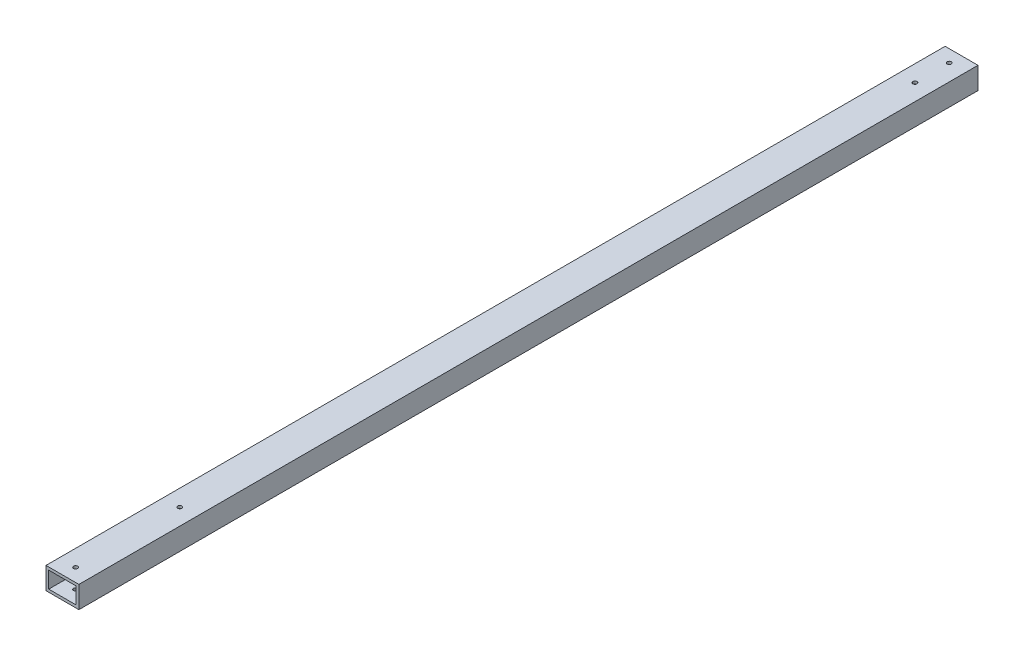
ISO-10303-21;
HEADER;
FILE_DESCRIPTION(('STEP AP214'),'2;1');
FILE_NAME('part.step','',(''),(''),'','','');
FILE_SCHEMA(('AUTOMOTIVE_DESIGN { 1 0 10303 214 1 1 1 1 }'));
ENDSEC;
DATA;
#1=APPLICATION_CONTEXT('core data for automotive mechanical design processes');
#2=APPLICATION_PROTOCOL_DEFINITION('international standard','automotive_design',2000,#1);
#3=PRODUCT_CONTEXT('',#1,'mechanical');
#4=PRODUCT('Part','Part','',(#3));
#5=PRODUCT_RELATED_PRODUCT_CATEGORY('part','',(#4));
#6=PRODUCT_DEFINITION_FORMATION('','',#4);
#7=PRODUCT_DEFINITION_CONTEXT('part definition',#1,'design');
#8=PRODUCT_DEFINITION('design','',#6,#7);
#9=PRODUCT_DEFINITION_SHAPE('','',#8);
#10=(LENGTH_UNIT() NAMED_UNIT(*) SI_UNIT(.MILLI.,.METRE.));
#11=(NAMED_UNIT(*) PLANE_ANGLE_UNIT() SI_UNIT($,.RADIAN.));
#12=(NAMED_UNIT(*) SI_UNIT($,.STERADIAN.) SOLID_ANGLE_UNIT());
#13=UNCERTAINTY_MEASURE_WITH_UNIT(LENGTH_MEASURE(1.E-05),#10,'distance_accuracy_value','');
#14=(GEOMETRIC_REPRESENTATION_CONTEXT(3) GLOBAL_UNCERTAINTY_ASSIGNED_CONTEXT((#13)) GLOBAL_UNIT_ASSIGNED_CONTEXT((#10,
#11,#12)) REPRESENTATION_CONTEXT('',''));
#15=CARTESIAN_POINT('',(0.,0.,0.));
#16=DIRECTION('',(0.,0.,1.));
#17=DIRECTION('',(1.,0.,0.));
#18=AXIS2_PLACEMENT_3D('',#15,#16,#17);
#19=CARTESIAN_POINT('',(19.05,-12.7,-520.7));
#20=DIRECTION('',(1.,0.,0.));
#21=DIRECTION('',(0.,0.,-1.));
#22=AXIS2_PLACEMENT_3D('',#19,#20,#21);
#23=PLANE('',#22);
#24=DIRECTION('',(0.,0.,1.));
#25=VECTOR('',#24,1.);
#26=CARTESIAN_POINT('',(19.05,12.7,-520.7));
#27=LINE('',#26,#25);
#28=CARTESIAN_POINT('',(19.05,12.7,-520.7));
#29=VERTEX_POINT('',#28);
#30=CARTESIAN_POINT('',(19.05,12.7,520.7));
#31=VERTEX_POINT('',#30);
#32=EDGE_CURVE('E161',#29,#31,#27,.T.);
#33=ORIENTED_EDGE('',*,*,#32,.T.);
#34=DIRECTION('',(0.,1.,0.));
#35=VECTOR('',#34,1.);
#36=CARTESIAN_POINT('',(19.05,-12.7,520.7));
#37=LINE('',#36,#35);
#38=CARTESIAN_POINT('',(19.05,-12.7,520.7));
#39=VERTEX_POINT('',#38);
#40=EDGE_CURVE('E129',#39,#31,#37,.T.);
#41=ORIENTED_EDGE('',*,*,#40,.F.);
#42=DIRECTION('',(0.,0.,1.));
#43=VECTOR('',#42,1.);
#44=CARTESIAN_POINT('',(19.05,-12.7,-520.7));
#45=LINE('',#44,#43);
#46=CARTESIAN_POINT('',(19.05,-12.7,-520.7));
#47=VERTEX_POINT('',#46);
#48=EDGE_CURVE('E11',#47,#39,#45,.T.);
#49=ORIENTED_EDGE('',*,*,#48,.F.);
#50=DIRECTION('',(0.,1.,0.));
#51=VECTOR('',#50,1.);
#52=CARTESIAN_POINT('',(19.05,-12.7,-520.7));
#53=LINE('',#52,#51);
#54=EDGE_CURVE('E148',#47,#29,#53,.T.);
#55=ORIENTED_EDGE('',*,*,#54,.T.);
#56=EDGE_LOOP('',(#33,#41,#49,#55));
#57=FACE_BOUND('',#56,.T.);
#58=ADVANCED_FACE('F32',(#57),#23,.T.);
#59=CARTESIAN_POINT('',(-19.05,-12.7,-520.7));
#60=DIRECTION('',(0.,-1.,0.));
#61=DIRECTION('',(0.,0.,-1.));
#62=AXIS2_PLACEMENT_3D('',#59,#60,#61);
#63=PLANE('',#62);
#64=CARTESIAN_POINT('',(0.,-12.7,-506.4125));
#65=DIRECTION('',(0.,-1.,0.));
#66=DIRECTION('',(0.,0.,-1.));
#67=AXIS2_PLACEMENT_3D('',#64,#65,#66);
#68=CIRCLE('',#67,2.38125000000001);
#69=CARTESIAN_POINT('',(0.,-12.7,-508.79375));
#70=VERTEX_POINT('',#69);
#71=EDGE_CURVE('E186',#70,#70,#68,.T.);
#72=ORIENTED_EDGE('',*,*,#71,.F.);
#73=EDGE_LOOP('',(#72));
#74=FACE_BOUND('',#73,.T.);
#75=CARTESIAN_POINT('',(0.,-12.7,-466.725));
#76=DIRECTION('',(0.,-1.,0.));
#77=DIRECTION('',(0.,0.,-1.));
#78=AXIS2_PLACEMENT_3D('',#75,#76,#77);
#79=CIRCLE('',#78,2.38125000000001);
#80=CARTESIAN_POINT('',(0.,-12.7,-469.10625));
#81=VERTEX_POINT('',#80);
#82=EDGE_CURVE('E183',#81,#81,#79,.T.);
#83=ORIENTED_EDGE('',*,*,#82,.F.);
#84=EDGE_LOOP('',(#83));
#85=FACE_BOUND('',#84,.T.);
#86=CARTESIAN_POINT('',(0.,-12.7,384.81));
#87=DIRECTION('',(0.,-1.,0.));
#88=DIRECTION('',(0.,0.,-1.));
#89=AXIS2_PLACEMENT_3D('',#86,#87,#88);
#90=CIRCLE('',#89,2.38125000000001);
#91=CARTESIAN_POINT('',(0.,-12.7,382.42875));
#92=VERTEX_POINT('',#91);
#93=EDGE_CURVE('E201',#92,#92,#90,.T.);
#94=ORIENTED_EDGE('',*,*,#93,.F.);
#95=EDGE_LOOP('',(#94));
#96=FACE_BOUND('',#95,.T.);
#97=CARTESIAN_POINT('',(0.,-12.7,505.46));
#98=DIRECTION('',(0.,-1.,0.));
#99=DIRECTION('',(0.,0.,-1.));
#100=AXIS2_PLACEMENT_3D('',#97,#98,#99);
#101=CIRCLE('',#100,2.38125000000001);
#102=CARTESIAN_POINT('',(0.,-12.7,503.07875));
#103=VERTEX_POINT('',#102);
#104=EDGE_CURVE('E118',#103,#103,#101,.T.);
#105=ORIENTED_EDGE('',*,*,#104,.F.);
#106=EDGE_LOOP('',(#105));
#107=FACE_BOUND('',#106,.T.);
#108=ORIENTED_EDGE('',*,*,#48,.T.);
#109=DIRECTION('',(1.,0.,0.));
#110=VECTOR('',#109,1.);
#111=CARTESIAN_POINT('',(-19.05,-12.7,520.7));
#112=LINE('',#111,#110);
#113=CARTESIAN_POINT('',(-19.05,-12.7,520.7));
#114=VERTEX_POINT('',#113);
#115=EDGE_CURVE('E138',#114,#39,#112,.T.);
#116=ORIENTED_EDGE('',*,*,#115,.F.);
#117=DIRECTION('',(0.,0.,1.));
#118=VECTOR('',#117,1.);
#119=CARTESIAN_POINT('',(-19.05,-12.7,-520.7));
#120=LINE('',#119,#118);
#121=CARTESIAN_POINT('',(-19.05,-12.7,-520.7));
#122=VERTEX_POINT('',#121);
#123=EDGE_CURVE('E40',#122,#114,#120,.T.);
#124=ORIENTED_EDGE('',*,*,#123,.F.);
#125=DIRECTION('',(1.,0.,0.));
#126=VECTOR('',#125,1.);
#127=CARTESIAN_POINT('',(-19.05,-12.7,-520.7));
#128=LINE('',#127,#126);
#129=EDGE_CURVE('E159',#122,#47,#128,.T.);
#130=ORIENTED_EDGE('',*,*,#129,.T.);
#131=EDGE_LOOP('',(#108,#116,#124,#130));
#132=FACE_BOUND('',#131,.T.);
#133=ADVANCED_FACE('F213',(#74,#85,#96,#107,#132),#63,.T.);
#134=CARTESIAN_POINT('',(-19.05,-12.7,-520.7));
#135=DIRECTION('',(-1.,0.,0.));
#136=DIRECTION('',(0.,0.,1.));
#137=AXIS2_PLACEMENT_3D('',#134,#135,#136);
#138=PLANE('',#137);
#139=ORIENTED_EDGE('',*,*,#123,.T.);
#140=DIRECTION('',(0.,-1.,0.));
#141=VECTOR('',#140,1.);
#142=CARTESIAN_POINT('',(-19.05,-12.7,520.7));
#143=LINE('',#142,#141);
#144=CARTESIAN_POINT('',(-19.05,12.7,520.7));
#145=VERTEX_POINT('',#144);
#146=EDGE_CURVE('E135',#145,#114,#143,.T.);
#147=ORIENTED_EDGE('',*,*,#146,.F.);
#148=DIRECTION('',(0.,0.,1.));
#149=VECTOR('',#148,1.);
#150=CARTESIAN_POINT('',(-19.05,12.7,-520.7));
#151=LINE('',#150,#149);
#152=CARTESIAN_POINT('',(-19.05,12.7,-520.7));
#153=VERTEX_POINT('',#152);
#154=EDGE_CURVE('E164',#153,#145,#151,.T.);
#155=ORIENTED_EDGE('',*,*,#154,.F.);
#156=DIRECTION('',(0.,-1.,0.));
#157=VECTOR('',#156,1.);
#158=CARTESIAN_POINT('',(-19.05,-12.7,-520.7));
#159=LINE('',#158,#157);
#160=EDGE_CURVE('E156',#153,#122,#159,.T.);
#161=ORIENTED_EDGE('',*,*,#160,.T.);
#162=EDGE_LOOP('',(#139,#147,#155,#161));
#163=FACE_BOUND('',#162,.T.);
#164=ADVANCED_FACE('F216',(#163),#138,.T.);
#165=CARTESIAN_POINT('',(-19.05,12.7,-520.7));
#166=DIRECTION('',(0.,1.,0.));
#167=DIRECTION('',(-1.,0.,0.));
#168=AXIS2_PLACEMENT_3D('',#165,#166,#167);
#169=PLANE('',#168);
#170=CARTESIAN_POINT('',(0.,12.7,-506.4125));
#171=DIRECTION('',(0.,1.,0.));
#172=DIRECTION('',(-1.,0.,0.));
#173=AXIS2_PLACEMENT_3D('',#170,#171,#172);
#174=CIRCLE('',#173,2.38125000000001);
#175=CARTESIAN_POINT('',(-2.38125000000001,12.7,-506.4125));
#176=VERTEX_POINT('',#175);
#177=EDGE_CURVE('E404',#176,#176,#174,.T.);
#178=ORIENTED_EDGE('',*,*,#177,.F.);
#179=EDGE_LOOP('',(#178));
#180=FACE_BOUND('',#179,.T.);
#181=CARTESIAN_POINT('',(0.,12.7,-466.725));
#182=DIRECTION('',(0.,1.,0.));
#183=DIRECTION('',(-1.,0.,0.));
#184=AXIS2_PLACEMENT_3D('',#181,#182,#183);
#185=CIRCLE('',#184,2.38125000000001);
#186=CARTESIAN_POINT('',(-2.38125000000001,12.7,-466.725));
#187=VERTEX_POINT('',#186);
#188=EDGE_CURVE('E179',#187,#187,#185,.T.);
#189=ORIENTED_EDGE('',*,*,#188,.F.);
#190=EDGE_LOOP('',(#189));
#191=FACE_BOUND('',#190,.T.);
#192=CARTESIAN_POINT('',(0.,12.7,384.81));
#193=DIRECTION('',(0.,1.,0.));
#194=DIRECTION('',(-1.,0.,0.));
#195=AXIS2_PLACEMENT_3D('',#192,#193,#194);
#196=CIRCLE('',#195,2.38125000000001);
#197=CARTESIAN_POINT('',(-2.38125000000001,12.7,384.81));
#198=VERTEX_POINT('',#197);
#199=EDGE_CURVE('E175',#198,#198,#196,.T.);
#200=ORIENTED_EDGE('',*,*,#199,.F.);
#201=EDGE_LOOP('',(#200));
#202=FACE_BOUND('',#201,.T.);
#203=CARTESIAN_POINT('',(0.,12.7,505.46));
#204=DIRECTION('',(0.,1.,0.));
#205=DIRECTION('',(-1.,0.,0.));
#206=AXIS2_PLACEMENT_3D('',#203,#204,#205);
#207=CIRCLE('',#206,2.38125000000001);
#208=CARTESIAN_POINT('',(-2.38125000000001,12.7,505.46));
#209=VERTEX_POINT('',#208);
#210=EDGE_CURVE('E171',#209,#209,#207,.T.);
#211=ORIENTED_EDGE('',*,*,#210,.F.);
#212=EDGE_LOOP('',(#211));
#213=FACE_BOUND('',#212,.T.);
#214=ORIENTED_EDGE('',*,*,#154,.T.);
#215=DIRECTION('',(-1.,0.,0.));
#216=VECTOR('',#215,1.);
#217=CARTESIAN_POINT('',(-19.05,12.7,520.7));
#218=LINE('',#217,#216);
#219=EDGE_CURVE('E132',#31,#145,#218,.T.);
#220=ORIENTED_EDGE('',*,*,#219,.F.);
#221=ORIENTED_EDGE('',*,*,#32,.F.);
#222=DIRECTION('',(-1.,0.,0.));
#223=VECTOR('',#222,1.);
#224=CARTESIAN_POINT('',(-19.05,12.7,-520.7));
#225=LINE('',#224,#223);
#226=EDGE_CURVE('E153',#29,#153,#225,.T.);
#227=ORIENTED_EDGE('',*,*,#226,.T.);
#228=EDGE_LOOP('',(#214,#220,#221,#227));
#229=FACE_BOUND('',#228,.T.);
#230=ADVANCED_FACE('F226',(#180,#191,#202,#213,#229),#169,.T.);
#231=CARTESIAN_POINT('',(0.,0.,-520.7));
#232=DIRECTION('',(0.,0.,-1.));
#233=DIRECTION('',(-1.,0.,0.));
#234=AXIS2_PLACEMENT_3D('',#231,#232,#233);
#235=PLANE('',#234);
#236=DIRECTION('',(0.,1.,0.));
#237=VECTOR('',#236,1.);
#238=CARTESIAN_POINT('',(15.875,-9.525,-520.7));
#239=LINE('',#238,#237);
#240=CARTESIAN_POINT('',(15.875,-9.525,-520.7));
#241=VERTEX_POINT('',#240);
#242=CARTESIAN_POINT('',(15.875,9.525,-520.7));
#243=VERTEX_POINT('',#242);
#244=EDGE_CURVE('E141',#241,#243,#239,.T.);
#245=ORIENTED_EDGE('',*,*,#244,.T.);
#246=DIRECTION('',(-1.,0.,0.));
#247=VECTOR('',#246,1.);
#248=CARTESIAN_POINT('',(-15.875,9.525,-520.7));
#249=LINE('',#248,#247);
#250=CARTESIAN_POINT('',(-15.875,9.525,-520.7));
#251=VERTEX_POINT('',#250);
#252=EDGE_CURVE('E104',#243,#251,#249,.T.);
#253=ORIENTED_EDGE('',*,*,#252,.T.);
#254=DIRECTION('',(0.,-1.,0.));
#255=VECTOR('',#254,1.);
#256=CARTESIAN_POINT('',(-15.875,-9.525,-520.7));
#257=LINE('',#256,#255);
#258=CARTESIAN_POINT('',(-15.875,-9.525,-520.7));
#259=VERTEX_POINT('',#258);
#260=EDGE_CURVE('E48',#251,#259,#257,.T.);
#261=ORIENTED_EDGE('',*,*,#260,.T.);
#262=DIRECTION('',(1.,0.,0.));
#263=VECTOR('',#262,1.);
#264=CARTESIAN_POINT('',(-15.875,-9.525,-520.7));
#265=LINE('',#264,#263);
#266=EDGE_CURVE('E109',#259,#241,#265,.T.);
#267=ORIENTED_EDGE('',*,*,#266,.T.);
#268=EDGE_LOOP('',(#245,#253,#261,#267));
#269=FACE_BOUND('',#268,.T.);
#270=ORIENTED_EDGE('',*,*,#54,.F.);
#271=ORIENTED_EDGE('',*,*,#129,.F.);
#272=ORIENTED_EDGE('',*,*,#160,.F.);
#273=ORIENTED_EDGE('',*,*,#226,.F.);
#274=EDGE_LOOP('',(#270,#271,#272,#273));
#275=FACE_BOUND('',#274,.T.);
#276=ADVANCED_FACE('F230',(#269,#275),#235,.T.);
#277=CARTESIAN_POINT('',(15.875,-9.525,-520.7));
#278=DIRECTION('',(1.,0.,0.));
#279=DIRECTION('',(0.,0.,-1.));
#280=AXIS2_PLACEMENT_3D('',#277,#278,#279);
#281=PLANE('',#280);
#282=DIRECTION('',(0.,0.,1.));
#283=VECTOR('',#282,1.);
#284=CARTESIAN_POINT('',(15.875,-9.525,-520.7));
#285=LINE('',#284,#283);
#286=CARTESIAN_POINT('',(15.875,-9.525,520.7));
#287=VERTEX_POINT('',#286);
#288=EDGE_CURVE('E114',#241,#287,#285,.T.);
#289=ORIENTED_EDGE('',*,*,#288,.T.);
#290=DIRECTION('',(0.,1.,0.));
#291=VECTOR('',#290,1.);
#292=CARTESIAN_POINT('',(15.875,-9.525,520.7));
#293=LINE('',#292,#291);
#294=CARTESIAN_POINT('',(15.875,9.525,520.7));
#295=VERTEX_POINT('',#294);
#296=EDGE_CURVE('E112',#287,#295,#293,.T.);
#297=ORIENTED_EDGE('',*,*,#296,.T.);
#298=DIRECTION('',(0.,0.,1.));
#299=VECTOR('',#298,1.);
#300=CARTESIAN_POINT('',(15.875,9.525,-520.7));
#301=LINE('',#300,#299);
#302=EDGE_CURVE('E97',#243,#295,#301,.T.);
#303=ORIENTED_EDGE('',*,*,#302,.F.);
#304=ORIENTED_EDGE('',*,*,#244,.F.);
#305=EDGE_LOOP('',(#289,#297,#303,#304));
#306=FACE_BOUND('',#305,.T.);
#307=ADVANCED_FACE('F113',(#306),#281,.F.);
#308=CARTESIAN_POINT('',(-15.875,-9.525,-520.7));
#309=DIRECTION('',(0.,-1.,0.));
#310=DIRECTION('',(0.,0.,-1.));
#311=AXIS2_PLACEMENT_3D('',#308,#309,#310);
#312=PLANE('',#311);
#313=CARTESIAN_POINT('',(0.,-9.52500000000001,-506.4125));
#314=DIRECTION('',(0.,-1.,0.));
#315=DIRECTION('',(0.,0.,-1.));
#316=AXIS2_PLACEMENT_3D('',#313,#314,#315);
#317=CIRCLE('',#316,2.38125000000001);
#318=CARTESIAN_POINT('',(0.,-9.52500000000001,-508.79375));
#319=VERTEX_POINT('',#318);
#320=EDGE_CURVE('E191',#319,#319,#317,.T.);
#321=ORIENTED_EDGE('',*,*,#320,.T.);
#322=EDGE_LOOP('',(#321));
#323=FACE_BOUND('',#322,.T.);
#324=CARTESIAN_POINT('',(0.,-9.52500000000001,-466.725));
#325=DIRECTION('',(0.,-1.,0.));
#326=DIRECTION('',(0.,0.,-1.));
#327=AXIS2_PLACEMENT_3D('',#324,#325,#326);
#328=CIRCLE('',#327,2.38125000000001);
#329=CARTESIAN_POINT('',(0.,-9.52500000000001,-469.10625));
#330=VERTEX_POINT('',#329);
#331=EDGE_CURVE('E178',#330,#330,#328,.T.);
#332=ORIENTED_EDGE('',*,*,#331,.T.);
#333=EDGE_LOOP('',(#332));
#334=FACE_BOUND('',#333,.T.);
#335=CARTESIAN_POINT('',(0.,-9.52500000000001,384.81));
#336=DIRECTION('',(0.,-1.,0.));
#337=DIRECTION('',(0.,0.,-1.));
#338=AXIS2_PLACEMENT_3D('',#335,#336,#337);
#339=CIRCLE('',#338,2.38125000000001);
#340=CARTESIAN_POINT('',(0.,-9.52500000000001,382.42875));
#341=VERTEX_POINT('',#340);
#342=EDGE_CURVE('E174',#341,#341,#339,.T.);
#343=ORIENTED_EDGE('',*,*,#342,.T.);
#344=EDGE_LOOP('',(#343));
#345=FACE_BOUND('',#344,.T.);
#346=CARTESIAN_POINT('',(0.,-9.52500000000001,505.46));
#347=DIRECTION('',(0.,-1.,0.));
#348=DIRECTION('',(0.,0.,-1.));
#349=AXIS2_PLACEMENT_3D('',#346,#347,#348);
#350=CIRCLE('',#349,2.38125000000001);
#351=CARTESIAN_POINT('',(0.,-9.52500000000001,503.07875));
#352=VERTEX_POINT('',#351);
#353=EDGE_CURVE('E170',#352,#352,#350,.T.);
#354=ORIENTED_EDGE('',*,*,#353,.T.);
#355=EDGE_LOOP('',(#354));
#356=FACE_BOUND('',#355,.T.);
#357=DIRECTION('',(0.,0.,1.));
#358=VECTOR('',#357,1.);
#359=CARTESIAN_POINT('',(-15.875,-9.525,-520.7));
#360=LINE('',#359,#358);
#361=CARTESIAN_POINT('',(-15.875,-9.525,520.7));
#362=VERTEX_POINT('',#361);
#363=EDGE_CURVE('E149',#259,#362,#360,.T.);
#364=ORIENTED_EDGE('',*,*,#363,.T.);
#365=DIRECTION('',(1.,0.,0.));
#366=VECTOR('',#365,1.);
#367=CARTESIAN_POINT('',(-15.875,-9.525,520.7));
#368=LINE('',#367,#366);
#369=EDGE_CURVE('E124',#362,#287,#368,.T.);
#370=ORIENTED_EDGE('',*,*,#369,.T.);
#371=ORIENTED_EDGE('',*,*,#288,.F.);
#372=ORIENTED_EDGE('',*,*,#266,.F.);
#373=EDGE_LOOP('',(#364,#370,#371,#372));
#374=FACE_BOUND('',#373,.T.);
#375=ADVANCED_FACE('F238',(#323,#334,#345,#356,#374),#312,.F.);
#376=CARTESIAN_POINT('',(-15.875,-9.525,-520.7));
#377=DIRECTION('',(-1.,0.,0.));
#378=DIRECTION('',(0.,0.,1.));
#379=AXIS2_PLACEMENT_3D('',#376,#377,#378);
#380=PLANE('',#379);
#381=DIRECTION('',(0.,0.,1.));
#382=VECTOR('',#381,1.);
#383=CARTESIAN_POINT('',(-15.875,9.525,-520.7));
#384=LINE('',#383,#382);
#385=CARTESIAN_POINT('',(-15.875,9.525,520.7));
#386=VERTEX_POINT('',#385);
#387=EDGE_CURVE('E108',#251,#386,#384,.T.);
#388=ORIENTED_EDGE('',*,*,#387,.T.);
#389=DIRECTION('',(0.,-1.,0.));
#390=VECTOR('',#389,1.);
#391=CARTESIAN_POINT('',(-15.875,-9.525,520.7));
#392=LINE('',#391,#390);
#393=EDGE_CURVE('E122',#386,#362,#392,.T.);
#394=ORIENTED_EDGE('',*,*,#393,.T.);
#395=ORIENTED_EDGE('',*,*,#363,.F.);
#396=ORIENTED_EDGE('',*,*,#260,.F.);
#397=EDGE_LOOP('',(#388,#394,#395,#396));
#398=FACE_BOUND('',#397,.T.);
#399=ADVANCED_FACE('F269',(#398),#380,.F.);
#400=CARTESIAN_POINT('',(-15.875,9.525,-520.7));
#401=DIRECTION('',(0.,1.,0.));
#402=DIRECTION('',(0.,0.,1.));
#403=AXIS2_PLACEMENT_3D('',#400,#401,#402);
#404=PLANE('',#403);
#405=CARTESIAN_POINT('',(0.,9.52500000000001,-506.4125));
#406=DIRECTION('',(0.,1.,0.));
#407=DIRECTION('',(0.,0.,1.));
#408=AXIS2_PLACEMENT_3D('',#405,#406,#407);
#409=CIRCLE('',#408,2.38125000000001);
#410=CARTESIAN_POINT('',(0.,9.52500000000001,-504.03125));
#411=VERTEX_POINT('',#410);
#412=EDGE_CURVE('E35',#411,#411,#409,.T.);
#413=ORIENTED_EDGE('',*,*,#412,.T.);
#414=EDGE_LOOP('',(#413));
#415=FACE_BOUND('',#414,.T.);
#416=CARTESIAN_POINT('',(0.,9.52500000000001,-466.725));
#417=DIRECTION('',(0.,1.,0.));
#418=DIRECTION('',(0.,0.,1.));
#419=AXIS2_PLACEMENT_3D('',#416,#417,#418);
#420=CIRCLE('',#419,2.38125000000001);
#421=CARTESIAN_POINT('',(0.,9.52500000000001,-464.34375));
#422=VERTEX_POINT('',#421);
#423=EDGE_CURVE('E176',#422,#422,#420,.T.);
#424=ORIENTED_EDGE('',*,*,#423,.T.);
#425=EDGE_LOOP('',(#424));
#426=FACE_BOUND('',#425,.T.);
#427=CARTESIAN_POINT('',(0.,9.52500000000001,384.81));
#428=DIRECTION('',(0.,1.,0.));
#429=DIRECTION('',(0.,0.,1.));
#430=AXIS2_PLACEMENT_3D('',#427,#428,#429);
#431=CIRCLE('',#430,2.38125000000001);
#432=CARTESIAN_POINT('',(0.,9.52500000000001,387.19125));
#433=VERTEX_POINT('',#432);
#434=EDGE_CURVE('E172',#433,#433,#431,.T.);
#435=ORIENTED_EDGE('',*,*,#434,.T.);
#436=EDGE_LOOP('',(#435));
#437=FACE_BOUND('',#436,.T.);
#438=CARTESIAN_POINT('',(0.,9.52500000000001,505.46));
#439=DIRECTION('',(0.,1.,0.));
#440=DIRECTION('',(0.,0.,1.));
#441=AXIS2_PLACEMENT_3D('',#438,#439,#440);
#442=CIRCLE('',#441,2.38125000000001);
#443=CARTESIAN_POINT('',(0.,9.52500000000001,507.84125));
#444=VERTEX_POINT('',#443);
#445=EDGE_CURVE('E167',#444,#444,#442,.T.);
#446=ORIENTED_EDGE('',*,*,#445,.T.);
#447=EDGE_LOOP('',(#446));
#448=FACE_BOUND('',#447,.T.);
#449=ORIENTED_EDGE('',*,*,#302,.T.);
#450=DIRECTION('',(-1.,0.,0.));
#451=VECTOR('',#450,1.);
#452=CARTESIAN_POINT('',(-15.875,9.525,520.7));
#453=LINE('',#452,#451);
#454=EDGE_CURVE('E101',#295,#386,#453,.T.);
#455=ORIENTED_EDGE('',*,*,#454,.T.);
#456=ORIENTED_EDGE('',*,*,#387,.F.);
#457=ORIENTED_EDGE('',*,*,#252,.F.);
#458=EDGE_LOOP('',(#449,#455,#456,#457));
#459=FACE_BOUND('',#458,.T.);
#460=ADVANCED_FACE('F99',(#415,#426,#437,#448,#459),#404,.F.);
#461=CARTESIAN_POINT('',(0.,0.,520.7));
#462=DIRECTION('',(0.,0.,-1.));
#463=DIRECTION('',(-1.,0.,0.));
#464=AXIS2_PLACEMENT_3D('',#461,#462,#463);
#465=PLANE('',#464);
#466=ORIENTED_EDGE('',*,*,#40,.T.);
#467=ORIENTED_EDGE('',*,*,#219,.T.);
#468=ORIENTED_EDGE('',*,*,#146,.T.);
#469=ORIENTED_EDGE('',*,*,#115,.T.);
#470=EDGE_LOOP('',(#466,#467,#468,#469));
#471=FACE_BOUND('',#470,.T.);
#472=ORIENTED_EDGE('',*,*,#296,.F.);
#473=ORIENTED_EDGE('',*,*,#369,.F.);
#474=ORIENTED_EDGE('',*,*,#393,.F.);
#475=ORIENTED_EDGE('',*,*,#454,.F.);
#476=EDGE_LOOP('',(#472,#473,#474,#475));
#477=FACE_BOUND('',#476,.T.);
#478=ADVANCED_FACE('F120',(#471,#477),#465,.F.);
#479=CARTESIAN_POINT('',(0.,-508.,505.46));
#480=DIRECTION('',(0.,1.,0.));
#481=DIRECTION('',(-1.,0.,0.));
#482=AXIS2_PLACEMENT_3D('',#479,#480,#481);
#483=CYLINDRICAL_SURFACE('',#482,2.38125000000001);
#484=ORIENTED_EDGE('',*,*,#210,.T.);
#485=EDGE_LOOP('',(#484));
#486=FACE_BOUND('',#485,.T.);
#487=ORIENTED_EDGE('',*,*,#445,.F.);
#488=EDGE_LOOP('',(#487));
#489=FACE_BOUND('',#488,.T.);
#490=ADVANCED_FACE('F335',(#486,#489),#483,.F.);
#491=ORIENTED_EDGE('',*,*,#104,.T.);
#492=EDGE_LOOP('',(#491));
#493=FACE_BOUND('',#492,.T.);
#494=ORIENTED_EDGE('',*,*,#353,.F.);
#495=EDGE_LOOP('',(#494));
#496=FACE_BOUND('',#495,.T.);
#497=ADVANCED_FACE('F210',(#493,#496),#483,.F.);
#498=CARTESIAN_POINT('',(0.,-508.,384.81));
#499=DIRECTION('',(0.,1.,0.));
#500=DIRECTION('',(-1.,0.,0.));
#501=AXIS2_PLACEMENT_3D('',#498,#499,#500);
#502=CYLINDRICAL_SURFACE('',#501,2.38125000000001);
#503=ORIENTED_EDGE('',*,*,#199,.T.);
#504=EDGE_LOOP('',(#503));
#505=FACE_BOUND('',#504,.T.);
#506=ORIENTED_EDGE('',*,*,#434,.F.);
#507=EDGE_LOOP('',(#506));
#508=FACE_BOUND('',#507,.T.);
#509=ADVANCED_FACE('F331',(#505,#508),#502,.F.);
#510=ORIENTED_EDGE('',*,*,#93,.T.);
#511=EDGE_LOOP('',(#510));
#512=FACE_BOUND('',#511,.T.);
#513=ORIENTED_EDGE('',*,*,#342,.F.);
#514=EDGE_LOOP('',(#513));
#515=FACE_BOUND('',#514,.T.);
#516=ADVANCED_FACE('F295',(#512,#515),#502,.F.);
#517=CARTESIAN_POINT('',(0.,-87.3,-466.725));
#518=DIRECTION('',(0.,1.,0.));
#519=DIRECTION('',(-1.,0.,0.));
#520=AXIS2_PLACEMENT_3D('',#517,#518,#519);
#521=CYLINDRICAL_SURFACE('',#520,2.38125000000001);
#522=ORIENTED_EDGE('',*,*,#188,.T.);
#523=EDGE_LOOP('',(#522));
#524=FACE_BOUND('',#523,.T.);
#525=ORIENTED_EDGE('',*,*,#423,.F.);
#526=EDGE_LOOP('',(#525));
#527=FACE_BOUND('',#526,.T.);
#528=ADVANCED_FACE('F289',(#524,#527),#521,.F.);
#529=ORIENTED_EDGE('',*,*,#82,.T.);
#530=EDGE_LOOP('',(#529));
#531=FACE_BOUND('',#530,.T.);
#532=ORIENTED_EDGE('',*,*,#331,.F.);
#533=EDGE_LOOP('',(#532));
#534=FACE_BOUND('',#533,.T.);
#535=ADVANCED_FACE('F294',(#531,#534),#521,.F.);
#536=CARTESIAN_POINT('',(0.,-87.3,-506.4125));
#537=DIRECTION('',(0.,1.,0.));
#538=DIRECTION('',(-1.,0.,0.));
#539=AXIS2_PLACEMENT_3D('',#536,#537,#538);
#540=CYLINDRICAL_SURFACE('',#539,2.38125000000001);
#541=ORIENTED_EDGE('',*,*,#177,.T.);
#542=EDGE_LOOP('',(#541));
#543=FACE_BOUND('',#542,.T.);
#544=ORIENTED_EDGE('',*,*,#412,.F.);
#545=EDGE_LOOP('',(#544));
#546=FACE_BOUND('',#545,.T.);
#547=ADVANCED_FACE('F306',(#543,#546),#540,.F.);
#548=ORIENTED_EDGE('',*,*,#71,.T.);
#549=EDGE_LOOP('',(#548));
#550=FACE_BOUND('',#549,.T.);
#551=ORIENTED_EDGE('',*,*,#320,.F.);
#552=EDGE_LOOP('',(#551));
#553=FACE_BOUND('',#552,.T.);
#554=ADVANCED_FACE('F315',(#550,#553),#540,.F.);
#555=CLOSED_SHELL('',(#58,#133,#164,#230,#276,#307,#375,#399,#460,#478,#490,#497,#509,#516,#528,
#535,#547,#554));
#556=MANIFOLD_SOLID_BREP('B2',#555);
#557=ADVANCED_BREP_SHAPE_REPRESENTATION('',(#18,#556),#14);
#558=SHAPE_DEFINITION_REPRESENTATION(#9,#557);
ENDSEC;
END-ISO-10303-21;
